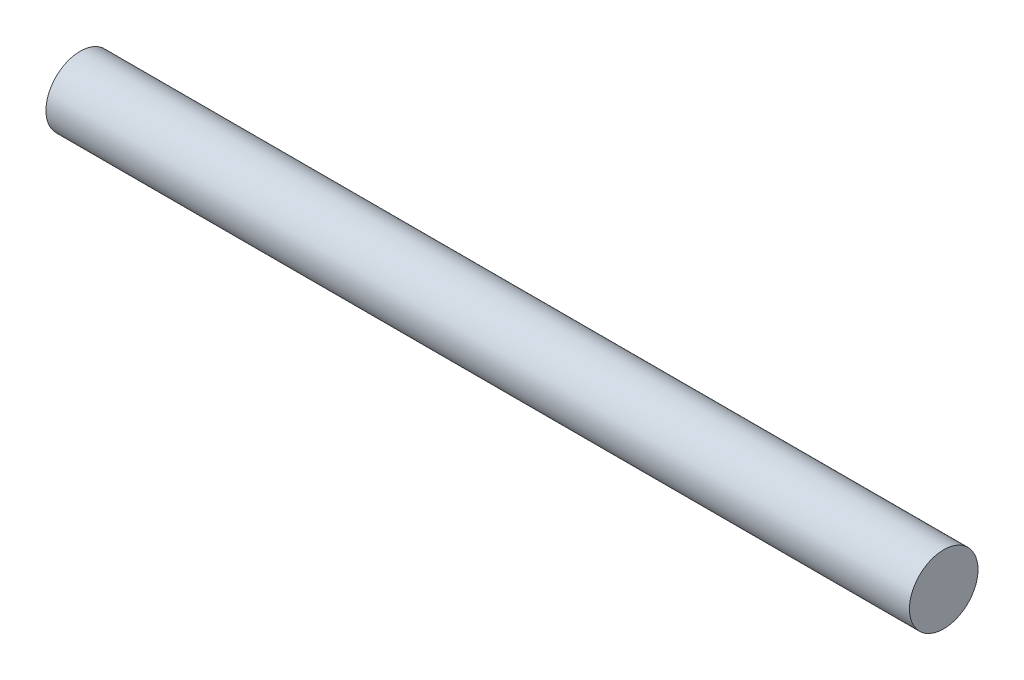
ISO-10303-21;
HEADER;
FILE_DESCRIPTION(('STEP AP214'),'2;1');
FILE_NAME('part.step','',(''),(''),'','','');
FILE_SCHEMA(('AUTOMOTIVE_DESIGN { 1 0 10303 214 1 1 1 1 }'));
ENDSEC;
DATA;
#1=APPLICATION_CONTEXT('core data for automotive mechanical design processes');
#2=APPLICATION_PROTOCOL_DEFINITION('international standard','automotive_design',2000,#1);
#3=PRODUCT_CONTEXT('',#1,'mechanical');
#4=PRODUCT('Part','Part','',(#3));
#5=PRODUCT_RELATED_PRODUCT_CATEGORY('part','',(#4));
#6=PRODUCT_DEFINITION_FORMATION('','',#4);
#7=PRODUCT_DEFINITION_CONTEXT('part definition',#1,'design');
#8=PRODUCT_DEFINITION('design','',#6,#7);
#9=PRODUCT_DEFINITION_SHAPE('','',#8);
#10=(LENGTH_UNIT() NAMED_UNIT(*) SI_UNIT(.MILLI.,.METRE.));
#11=(NAMED_UNIT(*) PLANE_ANGLE_UNIT() SI_UNIT($,.RADIAN.));
#12=(NAMED_UNIT(*) SI_UNIT($,.STERADIAN.) SOLID_ANGLE_UNIT());
#13=UNCERTAINTY_MEASURE_WITH_UNIT(LENGTH_MEASURE(1.E-05),#10,'distance_accuracy_value','');
#14=(GEOMETRIC_REPRESENTATION_CONTEXT(3) GLOBAL_UNCERTAINTY_ASSIGNED_CONTEXT((#13)) GLOBAL_UNIT_ASSIGNED_CONTEXT((#10,
#11,#12)) REPRESENTATION_CONTEXT('',''));
#15=CARTESIAN_POINT('',(0.,0.,0.));
#16=DIRECTION('',(0.,0.,1.));
#17=DIRECTION('',(1.,0.,0.));
#18=AXIS2_PLACEMENT_3D('',#15,#16,#17);
#19=CARTESIAN_POINT('',(62.95,0.,0.));
#20=DIRECTION('',(-1.,0.,0.));
#21=DIRECTION('',(0.,0.,1.));
#22=AXIS2_PLACEMENT_3D('',#19,#20,#21);
#23=CYLINDRICAL_SURFACE('',#22,2.5);
#24=CARTESIAN_POINT('',(62.95,0.,0.));
#25=DIRECTION('',(1.,0.,0.));
#26=DIRECTION('',(0.,0.,-1.));
#27=AXIS2_PLACEMENT_3D('',#24,#25,#26);
#28=CIRCLE('',#27,2.5);
#29=CARTESIAN_POINT('',(62.95,0.,-2.5));
#30=VERTEX_POINT('',#29);
#31=EDGE_CURVE('E10',#30,#30,#28,.T.);
#32=ORIENTED_EDGE('',*,*,#31,.F.);
#33=EDGE_LOOP('',(#32));
#34=FACE_BOUND('',#33,.T.);
#35=CARTESIAN_POINT('',(0.,0.,0.));
#36=DIRECTION('',(1.,0.,0.));
#37=DIRECTION('',(0.,0.,-1.));
#38=AXIS2_PLACEMENT_3D('',#35,#36,#37);
#39=CIRCLE('',#38,2.5);
#40=CARTESIAN_POINT('',(0.,0.,-2.5));
#41=VERTEX_POINT('',#40);
#42=EDGE_CURVE('E42',#41,#41,#39,.T.);
#43=ORIENTED_EDGE('',*,*,#42,.T.);
#44=EDGE_LOOP('',(#43));
#45=FACE_BOUND('',#44,.T.);
#46=ADVANCED_FACE('F39',(#34,#45),#23,.T.);
#47=CARTESIAN_POINT('',(62.95,0.,0.));
#48=DIRECTION('',(1.,0.,0.));
#49=DIRECTION('',(0.,0.,-1.));
#50=AXIS2_PLACEMENT_3D('',#47,#48,#49);
#51=PLANE('',#50);
#52=ORIENTED_EDGE('',*,*,#31,.T.);
#53=EDGE_LOOP('',(#52));
#54=FACE_BOUND('',#53,.T.);
#55=ADVANCED_FACE('F54',(#54),#51,.T.);
#56=CARTESIAN_POINT('',(0.,0.,0.));
#57=DIRECTION('',(1.,0.,0.));
#58=DIRECTION('',(0.,0.,-1.));
#59=AXIS2_PLACEMENT_3D('',#56,#57,#58);
#60=PLANE('',#59);
#61=ORIENTED_EDGE('',*,*,#42,.F.);
#62=EDGE_LOOP('',(#61));
#63=FACE_BOUND('',#62,.T.);
#64=ADVANCED_FACE('F52',(#63),#60,.F.);
#65=CLOSED_SHELL('',(#46,#55,#64));
#66=MANIFOLD_SOLID_BREP('B2',#65);
#67=ADVANCED_BREP_SHAPE_REPRESENTATION('',(#18,#66),#14);
#68=SHAPE_DEFINITION_REPRESENTATION(#9,#67);
ENDSEC;
END-ISO-10303-21;
